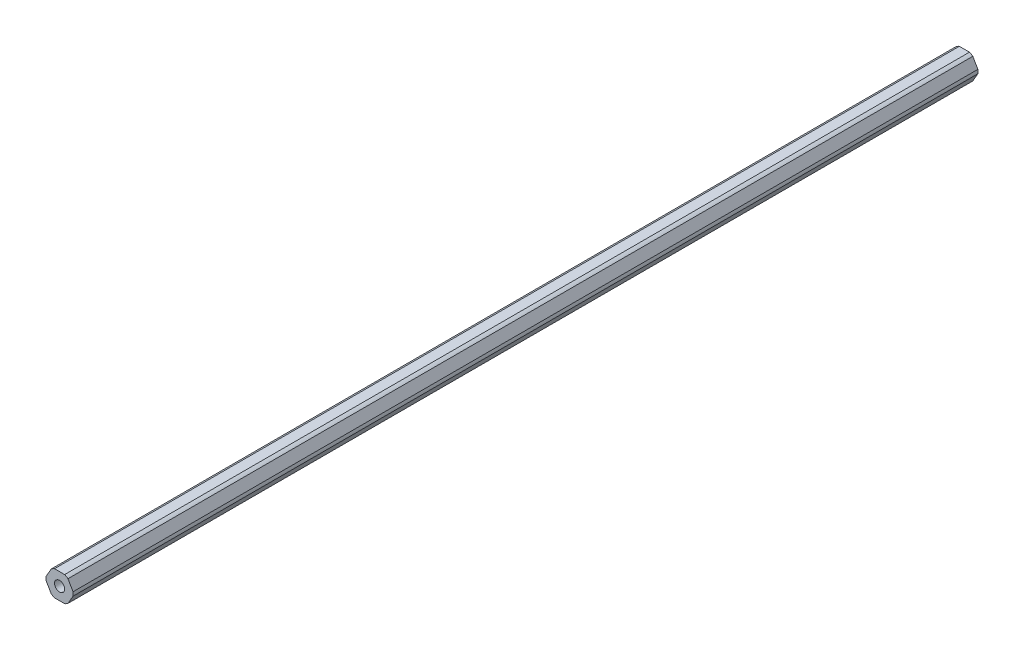
ISO-10303-21;
HEADER;
FILE_DESCRIPTION(('STEP AP214'),'2;1');
FILE_NAME('part.step','',(''),(''),'','','');
FILE_SCHEMA(('AUTOMOTIVE_DESIGN { 1 0 10303 214 1 1 1 1 }'));
ENDSEC;
DATA;
#1=APPLICATION_CONTEXT('core data for automotive mechanical design processes');
#2=APPLICATION_PROTOCOL_DEFINITION('international standard','automotive_design',2000,#1);
#3=PRODUCT_CONTEXT('',#1,'mechanical');
#4=PRODUCT('Part','Part','',(#3));
#5=PRODUCT_RELATED_PRODUCT_CATEGORY('part','',(#4));
#6=PRODUCT_DEFINITION_FORMATION('','',#4);
#7=PRODUCT_DEFINITION_CONTEXT('part definition',#1,'design');
#8=PRODUCT_DEFINITION('design','',#6,#7);
#9=PRODUCT_DEFINITION_SHAPE('','',#8);
#10=(LENGTH_UNIT() NAMED_UNIT(*) SI_UNIT(.MILLI.,.METRE.));
#11=(NAMED_UNIT(*) PLANE_ANGLE_UNIT() SI_UNIT($,.RADIAN.));
#12=(NAMED_UNIT(*) SI_UNIT($,.STERADIAN.) SOLID_ANGLE_UNIT());
#13=UNCERTAINTY_MEASURE_WITH_UNIT(LENGTH_MEASURE(1.E-05),#10,'distance_accuracy_value','');
#14=(GEOMETRIC_REPRESENTATION_CONTEXT(3) GLOBAL_UNCERTAINTY_ASSIGNED_CONTEXT((#13)) GLOBAL_UNIT_ASSIGNED_CONTEXT((#10,
#11,#12)) REPRESENTATION_CONTEXT('',''));
#15=CARTESIAN_POINT('',(0.,0.,0.));
#16=DIRECTION('',(0.,0.,1.));
#17=DIRECTION('',(1.,0.,0.));
#18=AXIS2_PLACEMENT_3D('',#15,#16,#17);
#19=CARTESIAN_POINT('',(0.,0.,-228.6));
#20=DIRECTION('',(0.,0.,1.));
#21=DIRECTION('',(1.,0.,0.));
#22=AXIS2_PLACEMENT_3D('',#19,#20,#21);
#23=CYLINDRICAL_SURFACE('',#22,6.87);
#24=CARTESIAN_POINT('',(0.,0.,228.6));
#25=DIRECTION('',(0.,0.,1.));
#26=DIRECTION('',(1.,0.,0.));
#27=AXIS2_PLACEMENT_3D('',#24,#25,#26);
#28=CIRCLE('',#27,6.87);
#29=CARTESIAN_POINT('',(2.55952629210953,-6.3754,228.6));
#30=VERTEX_POINT('',#29);
#31=CARTESIAN_POINT('',(4.24149521323254,-5.40431479062105,228.6));
#32=VERTEX_POINT('',#31);
#33=EDGE_CURVE('E154',#30,#32,#28,.T.);
#34=ORIENTED_EDGE('',*,*,#33,.F.);
#35=DIRECTION('',(0.,0.,1.));
#36=VECTOR('',#35,1.);
#37=CARTESIAN_POINT('',(2.55952629210953,-6.3754,-228.6));
#38=LINE('',#37,#36);
#39=CARTESIAN_POINT('',(2.55952629210953,-6.3754,-228.6));
#40=VERTEX_POINT('',#39);
#41=EDGE_CURVE('E11',#40,#30,#38,.T.);
#42=ORIENTED_EDGE('',*,*,#41,.F.);
#43=CARTESIAN_POINT('',(0.,0.,-228.6));
#44=DIRECTION('',(0.,0.,1.));
#45=DIRECTION('',(1.,0.,0.));
#46=AXIS2_PLACEMENT_3D('',#43,#44,#45);
#47=CIRCLE('',#46,6.87);
#48=CARTESIAN_POINT('',(4.24149521323254,-5.40431479062105,-228.6));
#49=VERTEX_POINT('',#48);
#50=EDGE_CURVE('E187',#40,#49,#47,.T.);
#51=ORIENTED_EDGE('',*,*,#50,.T.);
#52=DIRECTION('',(0.,0.,1.));
#53=VECTOR('',#52,1.);
#54=CARTESIAN_POINT('',(4.24149521323254,-5.40431479062105,-228.6));
#55=LINE('',#54,#53);
#56=EDGE_CURVE('E36',#49,#32,#55,.T.);
#57=ORIENTED_EDGE('',*,*,#56,.T.);
#58=EDGE_LOOP('',(#34,#42,#51,#57));
#59=FACE_BOUND('',#58,.T.);
#60=ADVANCED_FACE('F33',(#59),#23,.T.);
#61=CARTESIAN_POINT('',(-2.55952629210953,-6.3754,-228.6));
#62=DIRECTION('',(0.,-1.,0.));
#63=DIRECTION('',(1.,0.,0.));
#64=AXIS2_PLACEMENT_3D('',#61,#62,#63);
#65=PLANE('',#64);
#66=DIRECTION('',(1.,0.,0.));
#67=VECTOR('',#66,1.);
#68=CARTESIAN_POINT('',(-2.55952629210953,-6.3754,228.6));
#69=LINE('',#68,#67);
#70=CARTESIAN_POINT('',(-2.55952629210954,-6.3754,228.6));
#71=VERTEX_POINT('',#70);
#72=EDGE_CURVE('E185',#71,#30,#69,.T.);
#73=ORIENTED_EDGE('',*,*,#72,.F.);
#74=DIRECTION('',(0.,0.,1.));
#75=VECTOR('',#74,1.);
#76=CARTESIAN_POINT('',(-2.55952629210954,-6.3754,-228.6));
#77=LINE('',#76,#75);
#78=CARTESIAN_POINT('',(-2.55952629210954,-6.3754,-228.6));
#79=VERTEX_POINT('',#78);
#80=EDGE_CURVE('E42',#79,#71,#77,.T.);
#81=ORIENTED_EDGE('',*,*,#80,.F.);
#82=DIRECTION('',(1.,0.,0.));
#83=VECTOR('',#82,1.);
#84=CARTESIAN_POINT('',(-2.55952629210953,-6.3754,-228.6));
#85=LINE('',#84,#83);
#86=EDGE_CURVE('E144',#79,#40,#85,.T.);
#87=ORIENTED_EDGE('',*,*,#86,.T.);
#88=ORIENTED_EDGE('',*,*,#41,.T.);
#89=EDGE_LOOP('',(#73,#81,#87,#88));
#90=FACE_BOUND('',#89,.T.);
#91=ADVANCED_FACE('F207',(#90),#65,.T.);
#92=CARTESIAN_POINT('',(0.,0.,-228.6));
#93=DIRECTION('',(0.,0.,1.));
#94=DIRECTION('',(1.,0.,0.));
#95=AXIS2_PLACEMENT_3D('',#92,#93,#94);
#96=CYLINDRICAL_SURFACE('',#95,6.87);
#97=CARTESIAN_POINT('',(0.,0.,228.6));
#98=DIRECTION('',(0.,0.,1.));
#99=DIRECTION('',(1.,0.,0.));
#100=AXIS2_PLACEMENT_3D('',#97,#98,#99);
#101=CIRCLE('',#100,6.87);
#102=CARTESIAN_POINT('',(-4.24149521323255,-5.40431479062105,228.6));
#103=VERTEX_POINT('',#102);
#104=EDGE_CURVE('E131',#103,#71,#101,.T.);
#105=ORIENTED_EDGE('',*,*,#104,.F.);
#106=DIRECTION('',(0.,0.,1.));
#107=VECTOR('',#106,1.);
#108=CARTESIAN_POINT('',(-4.24149521323255,-5.40431479062105,-228.6));
#109=LINE('',#108,#107);
#110=CARTESIAN_POINT('',(-4.24149521323255,-5.40431479062105,-228.6));
#111=VERTEX_POINT('',#110);
#112=EDGE_CURVE('E126',#111,#103,#109,.T.);
#113=ORIENTED_EDGE('',*,*,#112,.F.);
#114=CARTESIAN_POINT('',(0.,0.,-228.6));
#115=DIRECTION('',(0.,0.,1.));
#116=DIRECTION('',(1.,0.,0.));
#117=AXIS2_PLACEMENT_3D('',#114,#115,#116);
#118=CIRCLE('',#117,6.87);
#119=EDGE_CURVE('E129',#111,#79,#118,.T.);
#120=ORIENTED_EDGE('',*,*,#119,.T.);
#121=ORIENTED_EDGE('',*,*,#80,.T.);
#122=EDGE_LOOP('',(#105,#113,#120,#121));
#123=FACE_BOUND('',#122,.T.);
#124=ADVANCED_FACE('F128',(#123),#96,.T.);
#125=CARTESIAN_POINT('',(-6.80102150534208,-0.971085209378955,-228.6));
#126=DIRECTION('',(-0.866025403784439,-0.5,0.));
#127=DIRECTION('',(0.5,-0.866025403784439,0.));
#128=AXIS2_PLACEMENT_3D('',#125,#126,#127);
#129=PLANE('',#128);
#130=DIRECTION('',(0.5,-0.866025403784439,0.));
#131=VECTOR('',#130,1.);
#132=CARTESIAN_POINT('',(-6.80102150534208,-0.971085209378955,228.6));
#133=LINE('',#132,#131);
#134=CARTESIAN_POINT('',(-6.80102150534208,-0.971085209378954,228.6));
#135=VERTEX_POINT('',#134);
#136=EDGE_CURVE('E182',#135,#103,#133,.T.);
#137=ORIENTED_EDGE('',*,*,#136,.F.);
#138=DIRECTION('',(0.,0.,1.));
#139=VECTOR('',#138,1.);
#140=CARTESIAN_POINT('',(-6.80102150534208,-0.971085209378954,-228.6));
#141=LINE('',#140,#139);
#142=CARTESIAN_POINT('',(-6.80102150534208,-0.971085209378954,-228.6));
#143=VERTEX_POINT('',#142);
#144=EDGE_CURVE('E136',#143,#135,#141,.T.);
#145=ORIENTED_EDGE('',*,*,#144,.F.);
#146=DIRECTION('',(0.5,-0.866025403784439,0.));
#147=VECTOR('',#146,1.);
#148=CARTESIAN_POINT('',(-6.80102150534208,-0.971085209378955,-228.6));
#149=LINE('',#148,#147);
#150=EDGE_CURVE('E142',#143,#111,#149,.T.);
#151=ORIENTED_EDGE('',*,*,#150,.T.);
#152=ORIENTED_EDGE('',*,*,#112,.T.);
#153=EDGE_LOOP('',(#137,#145,#151,#152));
#154=FACE_BOUND('',#153,.T.);
#155=ADVANCED_FACE('F146',(#154),#129,.T.);
#156=CARTESIAN_POINT('',(0.,0.,-228.6));
#157=DIRECTION('',(0.,0.,1.));
#158=DIRECTION('',(1.,0.,0.));
#159=AXIS2_PLACEMENT_3D('',#156,#157,#158);
#160=CYLINDRICAL_SURFACE('',#159,6.87);
#161=CARTESIAN_POINT('',(0.,0.,228.6));
#162=DIRECTION('',(0.,0.,1.));
#163=DIRECTION('',(1.,0.,0.));
#164=AXIS2_PLACEMENT_3D('',#161,#162,#163);
#165=CIRCLE('',#164,6.87);
#166=CARTESIAN_POINT('',(-6.80102150534208,0.971085209378961,228.6));
#167=VERTEX_POINT('',#166);
#168=EDGE_CURVE('E179',#167,#135,#165,.T.);
#169=ORIENTED_EDGE('',*,*,#168,.F.);
#170=DIRECTION('',(0.,0.,1.));
#171=VECTOR('',#170,1.);
#172=CARTESIAN_POINT('',(-6.80102150534208,0.971085209378961,-228.6));
#173=LINE('',#172,#171);
#174=CARTESIAN_POINT('',(-6.80102150534208,0.971085209378961,-228.6));
#175=VERTEX_POINT('',#174);
#176=EDGE_CURVE('E191',#175,#167,#173,.T.);
#177=ORIENTED_EDGE('',*,*,#176,.F.);
#178=CARTESIAN_POINT('',(0.,0.,-228.6));
#179=DIRECTION('',(0.,0.,1.));
#180=DIRECTION('',(1.,0.,0.));
#181=AXIS2_PLACEMENT_3D('',#178,#179,#180);
#182=CIRCLE('',#181,6.87);
#183=EDGE_CURVE('E147',#175,#143,#182,.T.);
#184=ORIENTED_EDGE('',*,*,#183,.T.);
#185=ORIENTED_EDGE('',*,*,#144,.T.);
#186=EDGE_LOOP('',(#169,#177,#184,#185));
#187=FACE_BOUND('',#186,.T.);
#188=ADVANCED_FACE('F220',(#187),#160,.T.);
#189=CARTESIAN_POINT('',(-4.24149521323255,5.40431479062105,-228.6));
#190=DIRECTION('',(-0.866025403784439,0.5,0.));
#191=DIRECTION('',(-0.5,-0.866025403784439,0.));
#192=AXIS2_PLACEMENT_3D('',#189,#190,#191);
#193=PLANE('',#192);
#194=DIRECTION('',(-0.5,-0.866025403784439,0.));
#195=VECTOR('',#194,1.);
#196=CARTESIAN_POINT('',(-4.24149521323255,5.40431479062105,228.6));
#197=LINE('',#196,#195);
#198=CARTESIAN_POINT('',(-4.24149521323255,5.40431479062104,228.6));
#199=VERTEX_POINT('',#198);
#200=EDGE_CURVE('E176',#199,#167,#197,.T.);
#201=ORIENTED_EDGE('',*,*,#200,.F.);
#202=DIRECTION('',(0.,0.,1.));
#203=VECTOR('',#202,1.);
#204=CARTESIAN_POINT('',(-4.24149521323255,5.40431479062104,-228.6));
#205=LINE('',#204,#203);
#206=CARTESIAN_POINT('',(-4.24149521323255,5.40431479062104,-228.6));
#207=VERTEX_POINT('',#206);
#208=EDGE_CURVE('E193',#207,#199,#205,.T.);
#209=ORIENTED_EDGE('',*,*,#208,.F.);
#210=DIRECTION('',(-0.5,-0.866025403784439,0.));
#211=VECTOR('',#210,1.);
#212=CARTESIAN_POINT('',(-4.24149521323255,5.40431479062105,-228.6));
#213=LINE('',#212,#211);
#214=EDGE_CURVE('E149',#207,#175,#213,.T.);
#215=ORIENTED_EDGE('',*,*,#214,.T.);
#216=ORIENTED_EDGE('',*,*,#176,.T.);
#217=EDGE_LOOP('',(#201,#209,#215,#216));
#218=FACE_BOUND('',#217,.T.);
#219=ADVANCED_FACE('F223',(#218),#193,.T.);
#220=CARTESIAN_POINT('',(0.,0.,-228.6));
#221=DIRECTION('',(0.,0.,1.));
#222=DIRECTION('',(1.,0.,0.));
#223=AXIS2_PLACEMENT_3D('',#220,#221,#222);
#224=CYLINDRICAL_SURFACE('',#223,6.87);
#225=CARTESIAN_POINT('',(0.,0.,228.6));
#226=DIRECTION('',(0.,0.,1.));
#227=DIRECTION('',(1.,0.,0.));
#228=AXIS2_PLACEMENT_3D('',#225,#226,#227);
#229=CIRCLE('',#228,6.87);
#230=CARTESIAN_POINT('',(-2.55952629210953,6.37540000000001,228.6));
#231=VERTEX_POINT('',#230);
#232=EDGE_CURVE('E173',#231,#199,#229,.T.);
#233=ORIENTED_EDGE('',*,*,#232,.F.);
#234=DIRECTION('',(0.,0.,1.));
#235=VECTOR('',#234,1.);
#236=CARTESIAN_POINT('',(-2.55952629210953,6.37540000000001,-228.6));
#237=LINE('',#236,#235);
#238=CARTESIAN_POINT('',(-2.55952629210953,6.37540000000001,-228.6));
#239=VERTEX_POINT('',#238);
#240=EDGE_CURVE('E195',#239,#231,#237,.T.);
#241=ORIENTED_EDGE('',*,*,#240,.F.);
#242=CARTESIAN_POINT('',(0.,0.,-228.6));
#243=DIRECTION('',(0.,0.,1.));
#244=DIRECTION('',(1.,0.,0.));
#245=AXIS2_PLACEMENT_3D('',#242,#243,#244);
#246=CIRCLE('',#245,6.87);
#247=EDGE_CURVE('E286',#239,#207,#246,.T.);
#248=ORIENTED_EDGE('',*,*,#247,.T.);
#249=ORIENTED_EDGE('',*,*,#208,.T.);
#250=EDGE_LOOP('',(#233,#241,#248,#249));
#251=FACE_BOUND('',#250,.T.);
#252=ADVANCED_FACE('F227',(#251),#224,.T.);
#253=CARTESIAN_POINT('',(2.55952629210953,6.37540000000001,-228.6));
#254=DIRECTION('',(0.,1.,0.));
#255=DIRECTION('',(0.,0.,1.));
#256=AXIS2_PLACEMENT_3D('',#253,#254,#255);
#257=PLANE('',#256);
#258=DIRECTION('',(-1.,0.,0.));
#259=VECTOR('',#258,1.);
#260=CARTESIAN_POINT('',(2.55952629210953,6.37540000000001,228.6));
#261=LINE('',#260,#259);
#262=CARTESIAN_POINT('',(2.55952629210953,6.37540000000001,228.6));
#263=VERTEX_POINT('',#262);
#264=EDGE_CURVE('E170',#263,#231,#261,.T.);
#265=ORIENTED_EDGE('',*,*,#264,.F.);
#266=DIRECTION('',(0.,0.,1.));
#267=VECTOR('',#266,1.);
#268=CARTESIAN_POINT('',(2.55952629210953,6.37540000000001,-228.6));
#269=LINE('',#268,#267);
#270=CARTESIAN_POINT('',(2.55952629210953,6.37540000000001,-228.6));
#271=VERTEX_POINT('',#270);
#272=EDGE_CURVE('E197',#271,#263,#269,.T.);
#273=ORIENTED_EDGE('',*,*,#272,.F.);
#274=DIRECTION('',(-1.,0.,0.));
#275=VECTOR('',#274,1.);
#276=CARTESIAN_POINT('',(2.55952629210953,6.37540000000001,-228.6));
#277=LINE('',#276,#275);
#278=EDGE_CURVE('E283',#271,#239,#277,.T.);
#279=ORIENTED_EDGE('',*,*,#278,.T.);
#280=ORIENTED_EDGE('',*,*,#240,.T.);
#281=EDGE_LOOP('',(#265,#273,#279,#280));
#282=FACE_BOUND('',#281,.T.);
#283=ADVANCED_FACE('F231',(#282),#257,.T.);
#284=CARTESIAN_POINT('',(0.,0.,-228.6));
#285=DIRECTION('',(0.,0.,1.));
#286=DIRECTION('',(1.,0.,0.));
#287=AXIS2_PLACEMENT_3D('',#284,#285,#286);
#288=CYLINDRICAL_SURFACE('',#287,6.87);
#289=CARTESIAN_POINT('',(0.,0.,228.6));
#290=DIRECTION('',(0.,0.,1.));
#291=DIRECTION('',(1.,0.,0.));
#292=AXIS2_PLACEMENT_3D('',#289,#290,#291);
#293=CIRCLE('',#292,6.87);
#294=CARTESIAN_POINT('',(4.24149521323254,5.40431479062105,228.6));
#295=VERTEX_POINT('',#294);
#296=EDGE_CURVE('E167',#295,#263,#293,.T.);
#297=ORIENTED_EDGE('',*,*,#296,.F.);
#298=DIRECTION('',(0.,0.,1.));
#299=VECTOR('',#298,1.);
#300=CARTESIAN_POINT('',(4.24149521323254,5.40431479062105,-228.6));
#301=LINE('',#300,#299);
#302=CARTESIAN_POINT('',(4.24149521323254,5.40431479062105,-228.6));
#303=VERTEX_POINT('',#302);
#304=EDGE_CURVE('E199',#303,#295,#301,.T.);
#305=ORIENTED_EDGE('',*,*,#304,.F.);
#306=CARTESIAN_POINT('',(0.,0.,-228.6));
#307=DIRECTION('',(0.,0.,1.));
#308=DIRECTION('',(1.,0.,0.));
#309=AXIS2_PLACEMENT_3D('',#306,#307,#308);
#310=CIRCLE('',#309,6.87);
#311=EDGE_CURVE('E280',#303,#271,#310,.T.);
#312=ORIENTED_EDGE('',*,*,#311,.T.);
#313=ORIENTED_EDGE('',*,*,#272,.T.);
#314=EDGE_LOOP('',(#297,#305,#312,#313));
#315=FACE_BOUND('',#314,.T.);
#316=ADVANCED_FACE('F235',(#315),#288,.T.);
#317=CARTESIAN_POINT('',(6.80102150534208,0.971085209378948,-228.6));
#318=DIRECTION('',(0.866025403784439,0.5,0.));
#319=DIRECTION('',(-0.5,0.866025403784439,0.));
#320=AXIS2_PLACEMENT_3D('',#317,#318,#319);
#321=PLANE('',#320);
#322=DIRECTION('',(-0.5,0.866025403784439,0.));
#323=VECTOR('',#322,1.);
#324=CARTESIAN_POINT('',(6.80102150534208,0.971085209378948,228.6));
#325=LINE('',#324,#323);
#326=CARTESIAN_POINT('',(6.80102150534208,0.971085209378949,228.6));
#327=VERTEX_POINT('',#326);
#328=EDGE_CURVE('E164',#327,#295,#325,.T.);
#329=ORIENTED_EDGE('',*,*,#328,.F.);
#330=DIRECTION('',(0.,0.,1.));
#331=VECTOR('',#330,1.);
#332=CARTESIAN_POINT('',(6.80102150534208,0.971085209378949,-228.6));
#333=LINE('',#332,#331);
#334=CARTESIAN_POINT('',(6.80102150534208,0.971085209378949,-228.6));
#335=VERTEX_POINT('',#334);
#336=EDGE_CURVE('E201',#335,#327,#333,.T.);
#337=ORIENTED_EDGE('',*,*,#336,.F.);
#338=DIRECTION('',(-0.5,0.866025403784439,0.));
#339=VECTOR('',#338,1.);
#340=CARTESIAN_POINT('',(6.80102150534208,0.971085209378948,-228.6));
#341=LINE('',#340,#339);
#342=EDGE_CURVE('E277',#335,#303,#341,.T.);
#343=ORIENTED_EDGE('',*,*,#342,.T.);
#344=ORIENTED_EDGE('',*,*,#304,.T.);
#345=EDGE_LOOP('',(#329,#337,#343,#344));
#346=FACE_BOUND('',#345,.T.);
#347=ADVANCED_FACE('F239',(#346),#321,.T.);
#348=CARTESIAN_POINT('',(0.,0.,-228.6));
#349=DIRECTION('',(0.,0.,1.));
#350=DIRECTION('',(1.,0.,0.));
#351=AXIS2_PLACEMENT_3D('',#348,#349,#350);
#352=CYLINDRICAL_SURFACE('',#351,6.87);
#353=CARTESIAN_POINT('',(0.,0.,228.6));
#354=DIRECTION('',(0.,0.,1.));
#355=DIRECTION('',(1.,0.,0.));
#356=AXIS2_PLACEMENT_3D('',#353,#354,#355);
#357=CIRCLE('',#356,6.87);
#358=CARTESIAN_POINT('',(6.80102150534208,-0.971085209378954,228.6));
#359=VERTEX_POINT('',#358);
#360=EDGE_CURVE('E161',#359,#327,#357,.T.);
#361=ORIENTED_EDGE('',*,*,#360,.F.);
#362=DIRECTION('',(0.,0.,1.));
#363=VECTOR('',#362,1.);
#364=CARTESIAN_POINT('',(6.80102150534208,-0.971085209378954,-228.6));
#365=LINE('',#364,#363);
#366=CARTESIAN_POINT('',(6.80102150534208,-0.971085209378954,-228.6));
#367=VERTEX_POINT('',#366);
#368=EDGE_CURVE('E202',#367,#359,#365,.T.);
#369=ORIENTED_EDGE('',*,*,#368,.F.);
#370=CARTESIAN_POINT('',(0.,0.,-228.6));
#371=DIRECTION('',(0.,0.,1.));
#372=DIRECTION('',(1.,0.,0.));
#373=AXIS2_PLACEMENT_3D('',#370,#371,#372);
#374=CIRCLE('',#373,6.87);
#375=EDGE_CURVE('E274',#367,#335,#374,.T.);
#376=ORIENTED_EDGE('',*,*,#375,.T.);
#377=ORIENTED_EDGE('',*,*,#336,.T.);
#378=EDGE_LOOP('',(#361,#369,#376,#377));
#379=FACE_BOUND('',#378,.T.);
#380=ADVANCED_FACE('F243',(#379),#352,.T.);
#381=CARTESIAN_POINT('',(4.24149521323254,-5.40431479062105,-228.6));
#382=DIRECTION('',(0.866025403784439,-0.5,0.));
#383=DIRECTION('',(0.5,0.866025403784439,0.));
#384=AXIS2_PLACEMENT_3D('',#381,#382,#383);
#385=PLANE('',#384);
#386=DIRECTION('',(0.5,0.866025403784439,0.));
#387=VECTOR('',#386,1.);
#388=CARTESIAN_POINT('',(4.24149521323254,-5.40431479062105,228.6));
#389=LINE('',#388,#387);
#390=EDGE_CURVE('E157',#32,#359,#389,.T.);
#391=ORIENTED_EDGE('',*,*,#390,.F.);
#392=ORIENTED_EDGE('',*,*,#56,.F.);
#393=DIRECTION('',(0.5,0.866025403784439,0.));
#394=VECTOR('',#393,1.);
#395=CARTESIAN_POINT('',(4.24149521323254,-5.40431479062105,-228.6));
#396=LINE('',#395,#394);
#397=EDGE_CURVE('E272',#49,#367,#396,.T.);
#398=ORIENTED_EDGE('',*,*,#397,.T.);
#399=ORIENTED_EDGE('',*,*,#368,.T.);
#400=EDGE_LOOP('',(#391,#392,#398,#399));
#401=FACE_BOUND('',#400,.T.);
#402=ADVANCED_FACE('F204',(#401),#385,.T.);
#403=CARTESIAN_POINT('',(0.,0.,-228.6));
#404=DIRECTION('',(0.,0.,1.));
#405=DIRECTION('',(1.,0.,0.));
#406=AXIS2_PLACEMENT_3D('',#403,#404,#405);
#407=PLANE('',#406);
#408=CARTESIAN_POINT('',(0.,0.,-228.6));
#409=DIRECTION('',(0.,0.,1.));
#410=DIRECTION('',(-1.,0.,0.));
#411=AXIS2_PLACEMENT_3D('',#408,#409,#410);
#412=CIRCLE('',#411,2.55);
#413=CARTESIAN_POINT('',(2.55,0.,-228.6));
#414=VERTEX_POINT('',#413);
#415=EDGE_CURVE('E158',#414,#414,#412,.T.);
#416=ORIENTED_EDGE('',*,*,#415,.T.);
#417=EDGE_LOOP('',(#416));
#418=FACE_BOUND('',#417,.T.);
#419=ORIENTED_EDGE('',*,*,#50,.F.);
#420=ORIENTED_EDGE('',*,*,#86,.F.);
#421=ORIENTED_EDGE('',*,*,#119,.F.);
#422=ORIENTED_EDGE('',*,*,#150,.F.);
#423=ORIENTED_EDGE('',*,*,#183,.F.);
#424=ORIENTED_EDGE('',*,*,#214,.F.);
#425=ORIENTED_EDGE('',*,*,#247,.F.);
#426=ORIENTED_EDGE('',*,*,#278,.F.);
#427=ORIENTED_EDGE('',*,*,#311,.F.);
#428=ORIENTED_EDGE('',*,*,#342,.F.);
#429=ORIENTED_EDGE('',*,*,#375,.F.);
#430=ORIENTED_EDGE('',*,*,#397,.F.);
#431=EDGE_LOOP('',(#419,#420,#421,#422,#423,#424,#425,#426,#427,#428,#429,#430));
#432=FACE_BOUND('',#431,.T.);
#433=ADVANCED_FACE('F140',(#418,#432),#407,.F.);
#434=CARTESIAN_POINT('',(0.,0.,228.6));
#435=DIRECTION('',(0.,0.,1.));
#436=DIRECTION('',(1.,0.,0.));
#437=AXIS2_PLACEMENT_3D('',#434,#435,#436);
#438=PLANE('',#437);
#439=CARTESIAN_POINT('',(0.,0.,228.6));
#440=DIRECTION('',(0.,0.,1.));
#441=DIRECTION('',(-1.,0.,0.));
#442=AXIS2_PLACEMENT_3D('',#439,#440,#441);
#443=CIRCLE('',#442,2.55);
#444=CARTESIAN_POINT('',(2.55,0.,228.6));
#445=VERTEX_POINT('',#444);
#446=EDGE_CURVE('E267',#445,#445,#443,.T.);
#447=ORIENTED_EDGE('',*,*,#446,.F.);
#448=EDGE_LOOP('',(#447));
#449=FACE_BOUND('',#448,.T.);
#450=ORIENTED_EDGE('',*,*,#33,.T.);
#451=ORIENTED_EDGE('',*,*,#390,.T.);
#452=ORIENTED_EDGE('',*,*,#360,.T.);
#453=ORIENTED_EDGE('',*,*,#328,.T.);
#454=ORIENTED_EDGE('',*,*,#296,.T.);
#455=ORIENTED_EDGE('',*,*,#264,.T.);
#456=ORIENTED_EDGE('',*,*,#232,.T.);
#457=ORIENTED_EDGE('',*,*,#200,.T.);
#458=ORIENTED_EDGE('',*,*,#168,.T.);
#459=ORIENTED_EDGE('',*,*,#136,.T.);
#460=ORIENTED_EDGE('',*,*,#104,.T.);
#461=ORIENTED_EDGE('',*,*,#72,.T.);
#462=EDGE_LOOP('',(#450,#451,#452,#453,#454,#455,#456,#457,#458,#459,#460,#461));
#463=FACE_BOUND('',#462,.T.);
#464=ADVANCED_FACE('F206',(#449,#463),#438,.T.);
#465=CARTESIAN_POINT('',(0.,0.,-228.6));
#466=DIRECTION('',(0.,0.,1.));
#467=DIRECTION('',(1.,0.,0.));
#468=AXIS2_PLACEMENT_3D('',#465,#466,#467);
#469=CYLINDRICAL_SURFACE('',#468,2.55);
#470=CARTESIAN_POINT('',(2.55,0.,-228.6));
#471=CARTESIAN_POINT('',(2.55,0.,-223.8375));
#472=CARTESIAN_POINT('',(2.55,0.,-219.075));
#473=CARTESIAN_POINT('',(2.55,0.,-209.55));
#474=CARTESIAN_POINT('',(2.55,0.,-204.7875));
#475=CARTESIAN_POINT('',(2.55,0.,-195.2625));
#476=CARTESIAN_POINT('',(2.55,0.,-190.5));
#477=CARTESIAN_POINT('',(2.55,0.,-180.975));
#478=CARTESIAN_POINT('',(2.55,0.,-176.2125));
#479=CARTESIAN_POINT('',(2.55,0.,-166.6875));
#480=CARTESIAN_POINT('',(2.55,0.,-161.925));
#481=CARTESIAN_POINT('',(2.55,0.,-152.4));
#482=CARTESIAN_POINT('',(2.55,0.,-147.6375));
#483=CARTESIAN_POINT('',(2.55,0.,-138.1125));
#484=CARTESIAN_POINT('',(2.55,0.,-133.35));
#485=CARTESIAN_POINT('',(2.55,0.,-123.825));
#486=CARTESIAN_POINT('',(2.55,0.,-119.0625));
#487=CARTESIAN_POINT('',(2.55,0.,-109.5375));
#488=CARTESIAN_POINT('',(2.55,0.,-104.775));
#489=CARTESIAN_POINT('',(2.55,0.,-95.2500000000001));
#490=CARTESIAN_POINT('',(2.55,0.,-90.4875000000001));
#491=CARTESIAN_POINT('',(2.55,0.,-80.9625000000001));
#492=CARTESIAN_POINT('',(2.55,0.,-76.2000000000001));
#493=CARTESIAN_POINT('',(2.55,0.,-66.6750000000001));
#494=CARTESIAN_POINT('',(2.55,0.,-61.9125000000001));
#495=CARTESIAN_POINT('',(2.55,0.,-52.3875000000001));
#496=CARTESIAN_POINT('',(2.55,0.,-47.6250000000001));
#497=CARTESIAN_POINT('',(2.55,0.,-38.1000000000001));
#498=CARTESIAN_POINT('',(2.55,0.,-33.3375000000001));
#499=CARTESIAN_POINT('',(2.55,0.,-23.8125000000001));
#500=CARTESIAN_POINT('',(2.55,0.,-19.0500000000001));
#501=CARTESIAN_POINT('',(2.55,0.,-9.52500000000009));
#502=CARTESIAN_POINT('',(2.55,0.,-4.76250000000009));
#503=CARTESIAN_POINT('',(2.55,0.,4.76249999999992));
#504=CARTESIAN_POINT('',(2.55,0.,9.52499999999992));
#505=CARTESIAN_POINT('',(2.55,0.,19.0499999999999));
#506=CARTESIAN_POINT('',(2.55,0.,23.8124999999999));
#507=CARTESIAN_POINT('',(2.55,0.,33.3374999999999));
#508=CARTESIAN_POINT('',(2.55,0.,38.0999999999999));
#509=CARTESIAN_POINT('',(2.55,0.,47.6249999999999));
#510=CARTESIAN_POINT('',(2.55,0.,52.3874999999999));
#511=CARTESIAN_POINT('',(2.55,0.,61.9124999999999));
#512=CARTESIAN_POINT('',(2.55,0.,66.6749999999999));
#513=CARTESIAN_POINT('',(2.55,0.,76.1999999999999));
#514=CARTESIAN_POINT('',(2.55,0.,80.9624999999999));
#515=CARTESIAN_POINT('',(2.55,0.,90.4874999999999));
#516=CARTESIAN_POINT('',(2.55,0.,95.2499999999999));
#517=CARTESIAN_POINT('',(2.55,0.,104.775));
#518=CARTESIAN_POINT('',(2.55,0.,109.5375));
#519=CARTESIAN_POINT('',(2.55,0.,119.0625));
#520=CARTESIAN_POINT('',(2.55,0.,123.825));
#521=CARTESIAN_POINT('',(2.55,0.,133.35));
#522=CARTESIAN_POINT('',(2.55,0.,138.1125));
#523=CARTESIAN_POINT('',(2.55,0.,147.6375));
#524=CARTESIAN_POINT('',(2.55,0.,152.4));
#525=CARTESIAN_POINT('',(2.55,0.,161.925));
#526=CARTESIAN_POINT('',(2.55,0.,166.6875));
#527=CARTESIAN_POINT('',(2.55,0.,176.2125));
#528=CARTESIAN_POINT('',(2.55,0.,180.975));
#529=CARTESIAN_POINT('',(2.55,0.,190.5));
#530=CARTESIAN_POINT('',(2.55,0.,195.2625));
#531=CARTESIAN_POINT('',(2.55,0.,204.7875));
#532=CARTESIAN_POINT('',(2.55,0.,209.55));
#533=CARTESIAN_POINT('',(2.55,0.,219.075));
#534=CARTESIAN_POINT('',(2.55,0.,223.8375));
#535=CARTESIAN_POINT('',(2.55,0.,228.6));
#536=B_SPLINE_CURVE_WITH_KNOTS('',3,(#470,#471,#472,#473,#474,#475,#476,#477,#478,#479,#480,
#481,#482,#483,#484,#485,#486,#487,#488,#489,#490,#491,#492,#493,#494,#495,#496,#497,#498,#499,
#500,#501,#502,#503,#504,#505,#506,#507,#508,#509,#510,#511,#512,#513,#514,#515,#516,#517,#518,
#519,#520,#521,#522,#523,#524,#525,#526,#527,#528,#529,#530,#531,#532,#533,#534,#535),
.UNSPECIFIED.,.F.,.F.,(4,2,2,2,2,2,2,2,2,2,2,2,2,2,2,2,2,2,2,2,2,2,2,2,2,2,2,2,2,2,2,2,4),(0.,
14.2875,28.575,42.8625,57.15,71.4375,85.725,100.0125,114.3,128.5875,142.875,157.1625,171.45,
185.7375,200.025,214.3125,228.6,242.8875,257.175,271.4625,285.75,300.0375,314.325,328.6125,
342.9,357.1875,371.475,385.7625,400.05,414.3375,428.625,442.9125,457.2),.UNSPECIFIED.);
#537=EDGE_CURVE('BSEAM255',#414,#445,#536,.T.);
#538=ORIENTED_EDGE('',*,*,#415,.F.);
#539=ORIENTED_EDGE('',*,*,#446,.T.);
#540=ORIENTED_EDGE('',*,*,#537,.T.);
#541=ORIENTED_EDGE('',*,*,#537,.F.);
#542=EDGE_LOOP('',(#538,#540,#539,#541));
#543=FACE_BOUND('',#542,.T.);
#544=ADVANCED_FACE('F255',(#543),#469,.F.);
#545=CLOSED_SHELL('',(#60,#91,#124,#155,#188,#219,#252,#283,#316,#347,#380,#402,#433,#464,#544));
#546=MANIFOLD_SOLID_BREP('B2',#545);
#547=ADVANCED_BREP_SHAPE_REPRESENTATION('',(#18,#546),#14);
#548=SHAPE_DEFINITION_REPRESENTATION(#9,#547);
ENDSEC;
END-ISO-10303-21;
